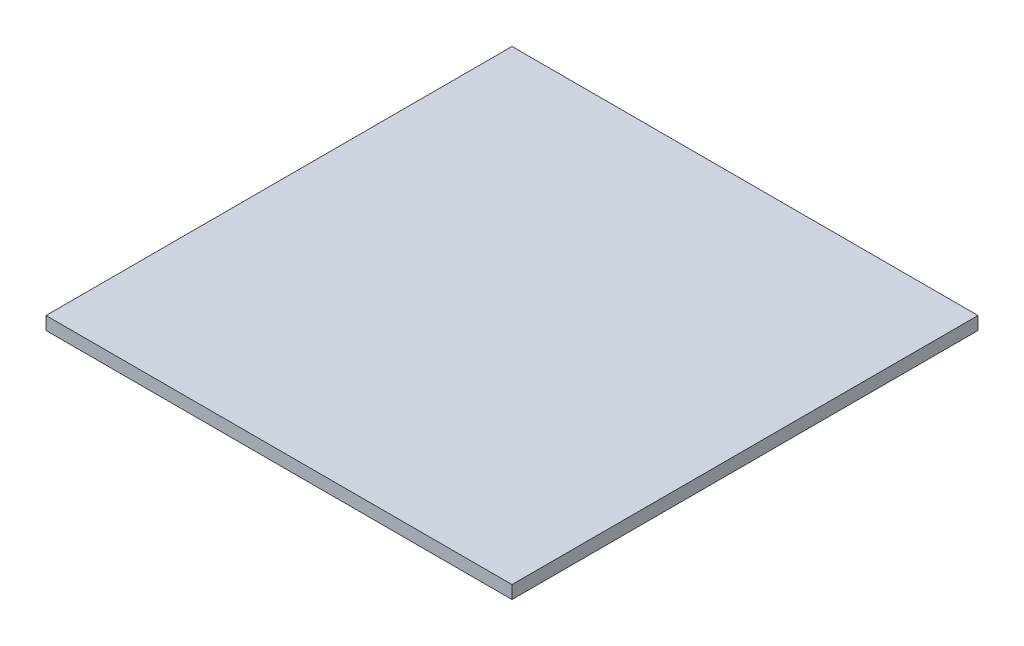
ISO-10303-21;
HEADER;
FILE_DESCRIPTION(('STEP AP214'),'2;1');
FILE_NAME('part.step','',(''),(''),'','','');
FILE_SCHEMA(('AUTOMOTIVE_DESIGN { 1 0 10303 214 1 1 1 1 }'));
ENDSEC;
DATA;
#1=APPLICATION_CONTEXT('core data for automotive mechanical design processes');
#2=APPLICATION_PROTOCOL_DEFINITION('international standard','automotive_design',2000,#1);
#3=PRODUCT_CONTEXT('',#1,'mechanical');
#4=PRODUCT('Part','Part','',(#3));
#5=PRODUCT_RELATED_PRODUCT_CATEGORY('part','',(#4));
#6=PRODUCT_DEFINITION_FORMATION('','',#4);
#7=PRODUCT_DEFINITION_CONTEXT('part definition',#1,'design');
#8=PRODUCT_DEFINITION('design','',#6,#7);
#9=PRODUCT_DEFINITION_SHAPE('','',#8);
#10=(LENGTH_UNIT() NAMED_UNIT(*) SI_UNIT(.MILLI.,.METRE.));
#11=(NAMED_UNIT(*) PLANE_ANGLE_UNIT() SI_UNIT($,.RADIAN.));
#12=(NAMED_UNIT(*) SI_UNIT($,.STERADIAN.) SOLID_ANGLE_UNIT());
#13=UNCERTAINTY_MEASURE_WITH_UNIT(LENGTH_MEASURE(1.E-05),#10,'distance_accuracy_value','');
#14=(GEOMETRIC_REPRESENTATION_CONTEXT(3) GLOBAL_UNCERTAINTY_ASSIGNED_CONTEXT((#13)) GLOBAL_UNIT_ASSIGNED_CONTEXT((#10,
#11,#12)) REPRESENTATION_CONTEXT('',''));
#15=CARTESIAN_POINT('',(0.,0.,0.));
#16=DIRECTION('',(0.,0.,1.));
#17=DIRECTION('',(1.,0.,0.));
#18=AXIS2_PLACEMENT_3D('',#15,#16,#17);
#19=CARTESIAN_POINT('',(33.5,6.,42.2484030110668));
#20=DIRECTION('',(0.,0.,-1.));
#21=DIRECTION('',(-1.,0.,0.));
#22=AXIS2_PLACEMENT_3D('',#19,#20,#21);
#23=PLANE('',#22);
#24=DIRECTION('',(1.,0.,0.));
#25=VECTOR('',#24,1.);
#26=CARTESIAN_POINT('',(33.5,0.,42.2484030110668));
#27=LINE('',#26,#25);
#28=CARTESIAN_POINT('',(-181.5,0.,42.2484030110668));
#29=VERTEX_POINT('',#28);
#30=CARTESIAN_POINT('',(33.5,0.,42.2484030110668));
#31=VERTEX_POINT('',#30);
#32=EDGE_CURVE('E95',#29,#31,#27,.T.);
#33=ORIENTED_EDGE('',*,*,#32,.T.);
#34=DIRECTION('',(0.,-1.,0.));
#35=VECTOR('',#34,1.);
#36=CARTESIAN_POINT('',(33.5,6.,42.2484030110668));
#37=LINE('',#36,#35);
#38=CARTESIAN_POINT('',(33.5,6.,42.2484030110668));
#39=VERTEX_POINT('',#38);
#40=EDGE_CURVE('E11',#39,#31,#37,.T.);
#41=ORIENTED_EDGE('',*,*,#40,.F.);
#42=DIRECTION('',(1.,0.,0.));
#43=VECTOR('',#42,1.);
#44=CARTESIAN_POINT('',(33.5,6.,42.2484030110668));
#45=LINE('',#44,#43);
#46=CARTESIAN_POINT('',(-181.5,6.,42.2484030110668));
#47=VERTEX_POINT('',#46);
#48=EDGE_CURVE('E83',#47,#39,#45,.T.);
#49=ORIENTED_EDGE('',*,*,#48,.F.);
#50=DIRECTION('',(0.,-1.,0.));
#51=VECTOR('',#50,1.);
#52=CARTESIAN_POINT('',(-181.5,6.,42.2484030110668));
#53=LINE('',#52,#51);
#54=EDGE_CURVE('E91',#47,#29,#53,.T.);
#55=ORIENTED_EDGE('',*,*,#54,.T.);
#56=EDGE_LOOP('',(#33,#41,#49,#55));
#57=FACE_BOUND('',#56,.T.);
#58=ADVANCED_FACE('F32',(#57),#23,.F.);
#59=CARTESIAN_POINT('',(33.5,6.,42.2484030110668));
#60=DIRECTION('',(-1.,0.,0.));
#61=DIRECTION('',(0.,0.,1.));
#62=AXIS2_PLACEMENT_3D('',#59,#60,#61);
#63=PLANE('',#62);
#64=DIRECTION('',(0.,0.,-1.));
#65=VECTOR('',#64,1.);
#66=CARTESIAN_POINT('',(33.5,0.,42.2484030110668));
#67=LINE('',#66,#65);
#68=CARTESIAN_POINT('',(33.5,0.,-172.751596988933));
#69=VERTEX_POINT('',#68);
#70=EDGE_CURVE('E87',#31,#69,#67,.T.);
#71=ORIENTED_EDGE('',*,*,#70,.T.);
#72=DIRECTION('',(0.,-1.,0.));
#73=VECTOR('',#72,1.);
#74=CARTESIAN_POINT('',(33.5,6.,-172.751596988933));
#75=LINE('',#74,#73);
#76=CARTESIAN_POINT('',(33.5,6.,-172.751596988933));
#77=VERTEX_POINT('',#76);
#78=EDGE_CURVE('E40',#77,#69,#75,.T.);
#79=ORIENTED_EDGE('',*,*,#78,.F.);
#80=DIRECTION('',(0.,0.,-1.));
#81=VECTOR('',#80,1.);
#82=CARTESIAN_POINT('',(33.5,6.,42.2484030110668));
#83=LINE('',#82,#81);
#84=EDGE_CURVE('E78',#39,#77,#83,.T.);
#85=ORIENTED_EDGE('',*,*,#84,.F.);
#86=ORIENTED_EDGE('',*,*,#40,.T.);
#87=EDGE_LOOP('',(#71,#79,#85,#86));
#88=FACE_BOUND('',#87,.T.);
#89=ADVANCED_FACE('F86',(#88),#63,.F.);
#90=CARTESIAN_POINT('',(33.5,6.,-172.751596988933));
#91=DIRECTION('',(0.,0.,1.));
#92=DIRECTION('',(1.,0.,0.));
#93=AXIS2_PLACEMENT_3D('',#90,#91,#92);
#94=PLANE('',#93);
#95=DIRECTION('',(-1.,0.,0.));
#96=VECTOR('',#95,1.);
#97=CARTESIAN_POINT('',(33.5,0.,-172.751596988933));
#98=LINE('',#97,#96);
#99=CARTESIAN_POINT('',(-181.5,0.,-172.751596988933));
#100=VERTEX_POINT('',#99);
#101=EDGE_CURVE('E65',#69,#100,#98,.T.);
#102=ORIENTED_EDGE('',*,*,#101,.T.);
#103=DIRECTION('',(0.,-1.,0.));
#104=VECTOR('',#103,1.);
#105=CARTESIAN_POINT('',(-181.5,6.,-172.751596988933));
#106=LINE('',#105,#104);
#107=CARTESIAN_POINT('',(-181.5,6.,-172.751596988933));
#108=VERTEX_POINT('',#107);
#109=EDGE_CURVE('E88',#108,#100,#106,.T.);
#110=ORIENTED_EDGE('',*,*,#109,.F.);
#111=DIRECTION('',(-1.,0.,0.));
#112=VECTOR('',#111,1.);
#113=CARTESIAN_POINT('',(33.5,6.,-172.751596988933));
#114=LINE('',#113,#112);
#115=EDGE_CURVE('E81',#77,#108,#114,.T.);
#116=ORIENTED_EDGE('',*,*,#115,.F.);
#117=ORIENTED_EDGE('',*,*,#78,.T.);
#118=EDGE_LOOP('',(#102,#110,#116,#117));
#119=FACE_BOUND('',#118,.T.);
#120=ADVANCED_FACE('F89',(#119),#94,.F.);
#121=CARTESIAN_POINT('',(-181.5,6.,42.2484030110668));
#122=DIRECTION('',(1.,0.,0.));
#123=DIRECTION('',(0.,0.,-1.));
#124=AXIS2_PLACEMENT_3D('',#121,#122,#123);
#125=PLANE('',#124);
#126=DIRECTION('',(0.,0.,1.));
#127=VECTOR('',#126,1.);
#128=CARTESIAN_POINT('',(-181.5,0.,42.2484030110668));
#129=LINE('',#128,#127);
#130=EDGE_CURVE('E71',#100,#29,#129,.T.);
#131=ORIENTED_EDGE('',*,*,#130,.T.);
#132=ORIENTED_EDGE('',*,*,#54,.F.);
#133=DIRECTION('',(0.,0.,1.));
#134=VECTOR('',#133,1.);
#135=CARTESIAN_POINT('',(-181.5,6.,42.2484030110668));
#136=LINE('',#135,#134);
#137=EDGE_CURVE('E48',#108,#47,#136,.T.);
#138=ORIENTED_EDGE('',*,*,#137,.F.);
#139=ORIENTED_EDGE('',*,*,#109,.T.);
#140=EDGE_LOOP('',(#131,#132,#138,#139));
#141=FACE_BOUND('',#140,.T.);
#142=ADVANCED_FACE('F102',(#141),#125,.F.);
#143=CARTESIAN_POINT('',(0.,6.,0.));
#144=DIRECTION('',(0.,-1.,0.));
#145=DIRECTION('',(0.,0.,-1.));
#146=AXIS2_PLACEMENT_3D('',#143,#144,#145);
#147=PLANE('',#146);
#148=ORIENTED_EDGE('',*,*,#48,.T.);
#149=ORIENTED_EDGE('',*,*,#84,.T.);
#150=ORIENTED_EDGE('',*,*,#115,.T.);
#151=ORIENTED_EDGE('',*,*,#137,.T.);
#152=EDGE_LOOP('',(#148,#149,#150,#151));
#153=FACE_BOUND('',#152,.T.);
#154=ADVANCED_FACE('F79',(#153),#147,.F.);
#155=CARTESIAN_POINT('',(0.,0.,0.));
#156=DIRECTION('',(0.,-1.,0.));
#157=DIRECTION('',(0.,0.,-1.));
#158=AXIS2_PLACEMENT_3D('',#155,#156,#157);
#159=PLANE('',#158);
#160=ORIENTED_EDGE('',*,*,#32,.F.);
#161=ORIENTED_EDGE('',*,*,#130,.F.);
#162=ORIENTED_EDGE('',*,*,#101,.F.);
#163=ORIENTED_EDGE('',*,*,#70,.F.);
#164=EDGE_LOOP('',(#160,#161,#162,#163));
#165=FACE_BOUND('',#164,.T.);
#166=ADVANCED_FACE('F105',(#165),#159,.T.);
#167=CLOSED_SHELL('',(#58,#89,#120,#142,#154,#166));
#168=MANIFOLD_SOLID_BREP('B2',#167);
#169=ADVANCED_BREP_SHAPE_REPRESENTATION('',(#18,#168),#14);
#170=SHAPE_DEFINITION_REPRESENTATION(#9,#169);
ENDSEC;
END-ISO-10303-21;
